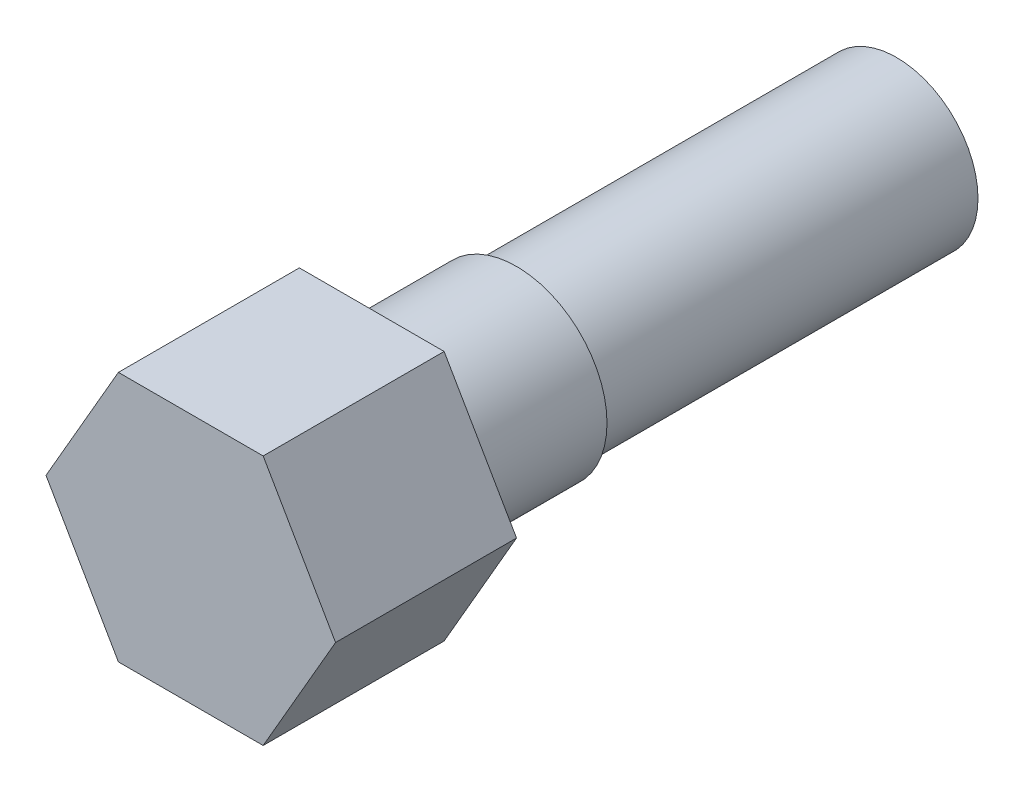
ISO-10303-21;
HEADER;
FILE_DESCRIPTION(('STEP AP214'),'2;1');
FILE_NAME('part.step','',(''),(''),'','','');
FILE_SCHEMA(('AUTOMOTIVE_DESIGN { 1 0 10303 214 1 1 1 1 }'));
ENDSEC;
DATA;
#1=APPLICATION_CONTEXT('core data for automotive mechanical design processes');
#2=APPLICATION_PROTOCOL_DEFINITION('international standard','automotive_design',2000,#1);
#3=PRODUCT_CONTEXT('',#1,'mechanical');
#4=PRODUCT('Part','Part','',(#3));
#5=PRODUCT_RELATED_PRODUCT_CATEGORY('part','',(#4));
#6=PRODUCT_DEFINITION_FORMATION('','',#4);
#7=PRODUCT_DEFINITION_CONTEXT('part definition',#1,'design');
#8=PRODUCT_DEFINITION('design','',#6,#7);
#9=PRODUCT_DEFINITION_SHAPE('','',#8);
#10=(LENGTH_UNIT() NAMED_UNIT(*) SI_UNIT(.MILLI.,.METRE.));
#11=(NAMED_UNIT(*) PLANE_ANGLE_UNIT() SI_UNIT($,.RADIAN.));
#12=(NAMED_UNIT(*) SI_UNIT($,.STERADIAN.) SOLID_ANGLE_UNIT());
#13=UNCERTAINTY_MEASURE_WITH_UNIT(LENGTH_MEASURE(1.E-05),#10,'distance_accuracy_value','');
#14=(GEOMETRIC_REPRESENTATION_CONTEXT(3) GLOBAL_UNCERTAINTY_ASSIGNED_CONTEXT((#13)) GLOBAL_UNIT_ASSIGNED_CONTEXT((#10,
#11,#12)) REPRESENTATION_CONTEXT('',''));
#15=CARTESIAN_POINT('',(0.,0.,0.));
#16=DIRECTION('',(0.,0.,1.));
#17=DIRECTION('',(1.,0.,0.));
#18=AXIS2_PLACEMENT_3D('',#15,#16,#17);
#19=CARTESIAN_POINT('',(0.,0.,-45.));
#20=DIRECTION('',(0.,0.,1.));
#21=DIRECTION('',(1.,0.,0.));
#22=AXIS2_PLACEMENT_3D('',#19,#20,#21);
#23=CYLINDRICAL_SURFACE('',#22,5.);
#24=CARTESIAN_POINT('',(0.,0.,0.));
#25=DIRECTION('',(0.,0.,1.));
#26=DIRECTION('',(1.,0.,0.));
#27=AXIS2_PLACEMENT_3D('',#24,#25,#26);
#28=CIRCLE('',#27,5.);
#29=CARTESIAN_POINT('',(5.,0.,0.));
#30=VERTEX_POINT('',#29);
#31=EDGE_CURVE('E11',#30,#30,#28,.F.);
#32=CARTESIAN_POINT('',(0.,0.,-8.));
#33=DIRECTION('',(0.,0.,-1.));
#34=DIRECTION('',(-1.,0.,0.));
#35=AXIS2_PLACEMENT_3D('',#32,#33,#34);
#36=CIRCLE('',#35,5.);
#37=CARTESIAN_POINT('',(5.,0.,-8.));
#38=VERTEX_POINT('',#37);
#39=EDGE_CURVE('E178',#38,#38,#36,.T.);
#40=CARTESIAN_POINT('',(5.,0.,0.));
#41=CARTESIAN_POINT('',(5.,0.,-0.0833333333333402));
#42=CARTESIAN_POINT('',(5.,0.,-0.166666666666674));
#43=CARTESIAN_POINT('',(5.,0.,-0.333333333333341));
#44=CARTESIAN_POINT('',(5.,0.,-0.416666666666674));
#45=CARTESIAN_POINT('',(5.,0.,-0.583333333333341));
#46=CARTESIAN_POINT('',(5.,0.,-0.666666666666674));
#47=CARTESIAN_POINT('',(5.,0.,-0.833333333333341));
#48=CARTESIAN_POINT('',(5.,0.,-0.916666666666674));
#49=CARTESIAN_POINT('',(5.,0.,-1.08333333333334));
#50=CARTESIAN_POINT('',(5.,0.,-1.16666666666667));
#51=CARTESIAN_POINT('',(5.,0.,-1.33333333333334));
#52=CARTESIAN_POINT('',(5.,0.,-1.41666666666667));
#53=CARTESIAN_POINT('',(5.,0.,-1.58333333333334));
#54=CARTESIAN_POINT('',(5.,0.,-1.66666666666667));
#55=CARTESIAN_POINT('',(5.,0.,-1.83333333333334));
#56=CARTESIAN_POINT('',(5.,0.,-1.91666666666668));
#57=CARTESIAN_POINT('',(5.,0.,-2.08333333333334));
#58=CARTESIAN_POINT('',(5.,0.,-2.16666666666667));
#59=CARTESIAN_POINT('',(5.,0.,-2.33333333333334));
#60=CARTESIAN_POINT('',(5.,0.,-2.41666666666667));
#61=CARTESIAN_POINT('',(5.,0.,-2.58333333333334));
#62=CARTESIAN_POINT('',(5.,0.,-2.66666666666667));
#63=CARTESIAN_POINT('',(5.,0.,-2.83333333333334));
#64=CARTESIAN_POINT('',(5.,0.,-2.91666666666667));
#65=CARTESIAN_POINT('',(5.,0.,-3.08333333333334));
#66=CARTESIAN_POINT('',(5.,0.,-3.16666666666667));
#67=CARTESIAN_POINT('',(5.,0.,-3.33333333333334));
#68=CARTESIAN_POINT('',(5.,0.,-3.41666666666667));
#69=CARTESIAN_POINT('',(5.,0.,-3.58333333333334));
#70=CARTESIAN_POINT('',(5.,0.,-3.66666666666667));
#71=CARTESIAN_POINT('',(5.,0.,-3.83333333333334));
#72=CARTESIAN_POINT('',(5.,0.,-3.91666666666667));
#73=CARTESIAN_POINT('',(5.,0.,-4.08333333333334));
#74=CARTESIAN_POINT('',(5.,0.,-4.16666666666667));
#75=CARTESIAN_POINT('',(5.,0.,-4.33333333333334));
#76=CARTESIAN_POINT('',(5.,0.,-4.41666666666667));
#77=CARTESIAN_POINT('',(5.,0.,-4.58333333333334));
#78=CARTESIAN_POINT('',(5.,0.,-4.66666666666667));
#79=CARTESIAN_POINT('',(5.,0.,-4.83333333333334));
#80=CARTESIAN_POINT('',(5.,0.,-4.91666666666667));
#81=CARTESIAN_POINT('',(5.,0.,-5.08333333333334));
#82=CARTESIAN_POINT('',(5.,0.,-5.16666666666667));
#83=CARTESIAN_POINT('',(5.,0.,-5.33333333333334));
#84=CARTESIAN_POINT('',(5.,0.,-5.41666666666667));
#85=CARTESIAN_POINT('',(5.,0.,-5.58333333333334));
#86=CARTESIAN_POINT('',(5.,0.,-5.66666666666667));
#87=CARTESIAN_POINT('',(5.,0.,-5.83333333333333));
#88=CARTESIAN_POINT('',(5.,0.,-5.91666666666666));
#89=CARTESIAN_POINT('',(5.,0.,-6.08333333333333));
#90=CARTESIAN_POINT('',(5.,0.,-6.16666666666667));
#91=CARTESIAN_POINT('',(5.,0.,-6.33333333333333));
#92=CARTESIAN_POINT('',(5.,0.,-6.41666666666667));
#93=CARTESIAN_POINT('',(5.,0.,-6.58333333333333));
#94=CARTESIAN_POINT('',(5.,0.,-6.66666666666667));
#95=CARTESIAN_POINT('',(5.,0.,-6.83333333333333));
#96=CARTESIAN_POINT('',(5.,0.,-6.91666666666667));
#97=CARTESIAN_POINT('',(5.,0.,-7.08333333333333));
#98=CARTESIAN_POINT('',(5.,0.,-7.16666666666667));
#99=CARTESIAN_POINT('',(5.,0.,-7.33333333333333));
#100=CARTESIAN_POINT('',(5.,0.,-7.41666666666667));
#101=CARTESIAN_POINT('',(5.,0.,-7.58333333333333));
#102=CARTESIAN_POINT('',(5.,0.,-7.66666666666667));
#103=CARTESIAN_POINT('',(5.,0.,-7.83333333333333));
#104=CARTESIAN_POINT('',(5.,0.,-7.91666666666667));
#105=CARTESIAN_POINT('',(5.,0.,-8.));
#106=B_SPLINE_CURVE_WITH_KNOTS('',3,(#40,#41,#42,#43,#44,#45,#46,#47,#48,#49,#50,#51,#52,#53,
#54,#55,#56,#57,#58,#59,#60,#61,#62,#63,#64,#65,#66,#67,#68,#69,#70,#71,#72,#73,#74,#75,#76,#77,
#78,#79,#80,#81,#82,#83,#84,#85,#86,#87,#88,#89,#90,#91,#92,#93,#94,#95,#96,#97,#98,#99,#100,
#101,#102,#103,#104,#105),.UNSPECIFIED.,.F.,.F.,(4,2,2,2,2,2,2,2,2,2,2,2,2,2,2,2,2,2,2,2,2,2,2,
2,2,2,2,2,2,2,2,2,4),(0.,0.25,0.5,0.750000000000001,1.,1.25,1.5,1.75,2.,2.25,2.5,2.75,3.,3.25,
3.5,3.75,4.,4.25,4.5,4.75,5.,5.25,5.5,5.74999999999999,5.99999999999999,6.24999999999999,
6.49999999999999,6.74999999999999,6.99999999999999,7.24999999999999,7.49999999999999,
7.74999999999999,7.99999999999999),.UNSPECIFIED.);
#107=EDGE_CURVE('BSEAM39',#30,#38,#106,.T.);
#108=ORIENTED_EDGE('',*,*,#31,.T.);
#109=ORIENTED_EDGE('',*,*,#39,.F.);
#110=ORIENTED_EDGE('',*,*,#107,.T.);
#111=ORIENTED_EDGE('',*,*,#107,.F.);
#112=EDGE_LOOP('',(#108,#110,#109,#111));
#113=FACE_BOUND('',#112,.T.);
#114=ADVANCED_FACE('F39',(#113),#23,.T.);
#115=CARTESIAN_POINT('',(0.,0.,10.));
#116=DIRECTION('',(0.,0.,1.));
#117=DIRECTION('',(1.,0.,0.));
#118=AXIS2_PLACEMENT_3D('',#115,#116,#117);
#119=PLANE('',#118);
#120=DIRECTION('',(0.5,0.866025403784439,0.));
#121=VECTOR('',#120,1.);
#122=CARTESIAN_POINT('',(4.,-6.92820323027551,10.));
#123=LINE('',#122,#121);
#124=CARTESIAN_POINT('',(4.,-6.92820323027551,10.));
#125=VERTEX_POINT('',#124);
#126=CARTESIAN_POINT('',(8.,0.,10.));
#127=VERTEX_POINT('',#126);
#128=EDGE_CURVE('E147',#125,#127,#123,.T.);
#129=ORIENTED_EDGE('',*,*,#128,.T.);
#130=DIRECTION('',(-0.5,0.866025403784438,0.));
#131=VECTOR('',#130,1.);
#132=CARTESIAN_POINT('',(8.,0.,10.));
#133=LINE('',#132,#131);
#134=CARTESIAN_POINT('',(4.,6.92820323027551,10.));
#135=VERTEX_POINT('',#134);
#136=EDGE_CURVE('E95',#127,#135,#133,.T.);
#137=ORIENTED_EDGE('',*,*,#136,.T.);
#138=DIRECTION('',(-1.,0.,0.));
#139=VECTOR('',#138,1.);
#140=CARTESIAN_POINT('',(4.,6.92820323027551,10.));
#141=LINE('',#140,#139);
#142=CARTESIAN_POINT('',(-4.,6.92820323027551,10.));
#143=VERTEX_POINT('',#142);
#144=EDGE_CURVE('E108',#135,#143,#141,.T.);
#145=ORIENTED_EDGE('',*,*,#144,.T.);
#146=DIRECTION('',(-0.5,-0.866025403784439,0.));
#147=VECTOR('',#146,1.);
#148=CARTESIAN_POINT('',(-4.,6.92820323027551,10.));
#149=LINE('',#148,#147);
#150=CARTESIAN_POINT('',(-8.,0.,10.));
#151=VERTEX_POINT('',#150);
#152=EDGE_CURVE('E102',#143,#151,#149,.T.);
#153=ORIENTED_EDGE('',*,*,#152,.T.);
#154=DIRECTION('',(0.5,-0.866025403784439,0.));
#155=VECTOR('',#154,1.);
#156=CARTESIAN_POINT('',(-8.,0.,10.));
#157=LINE('',#156,#155);
#158=CARTESIAN_POINT('',(-4.,-6.92820323027551,10.));
#159=VERTEX_POINT('',#158);
#160=EDGE_CURVE('E106',#151,#159,#157,.T.);
#161=ORIENTED_EDGE('',*,*,#160,.T.);
#162=DIRECTION('',(1.,0.,0.));
#163=VECTOR('',#162,1.);
#164=CARTESIAN_POINT('',(-4.,-6.92820323027551,10.));
#165=LINE('',#164,#163);
#166=EDGE_CURVE('E57',#159,#125,#165,.T.);
#167=ORIENTED_EDGE('',*,*,#166,.T.);
#168=EDGE_LOOP('',(#129,#137,#145,#153,#161,#167));
#169=FACE_BOUND('',#168,.T.);
#170=ADVANCED_FACE('F104',(#169),#119,.T.);
#171=CARTESIAN_POINT('',(8.,0.,10.));
#172=DIRECTION('',(-0.866025403784438,-0.5,0.));
#173=DIRECTION('',(0.5,-0.866025403784439,0.));
#174=AXIS2_PLACEMENT_3D('',#171,#172,#173);
#175=PLANE('',#174);
#176=DIRECTION('',(-0.5,0.866025403784438,0.));
#177=VECTOR('',#176,1.);
#178=CARTESIAN_POINT('',(8.,0.,0.));
#179=LINE('',#178,#177);
#180=CARTESIAN_POINT('',(8.,0.,0.));
#181=VERTEX_POINT('',#180);
#182=CARTESIAN_POINT('',(4.,6.92820323027551,0.));
#183=VERTEX_POINT('',#182);
#184=EDGE_CURVE('E134',#181,#183,#179,.T.);
#185=ORIENTED_EDGE('',*,*,#184,.T.);
#186=DIRECTION('',(0.,0.,-1.));
#187=VECTOR('',#186,1.);
#188=CARTESIAN_POINT('',(4.,6.92820323027551,10.));
#189=LINE('',#188,#187);
#190=EDGE_CURVE('E154',#135,#183,#189,.T.);
#191=ORIENTED_EDGE('',*,*,#190,.F.);
#192=ORIENTED_EDGE('',*,*,#136,.F.);
#193=DIRECTION('',(0.,0.,-1.));
#194=VECTOR('',#193,1.);
#195=CARTESIAN_POINT('',(8.,0.,10.));
#196=LINE('',#195,#194);
#197=EDGE_CURVE('E49',#127,#181,#196,.T.);
#198=ORIENTED_EDGE('',*,*,#197,.T.);
#199=EDGE_LOOP('',(#185,#191,#192,#198));
#200=FACE_BOUND('',#199,.T.);
#201=ADVANCED_FACE('F159',(#200),#175,.F.);
#202=CARTESIAN_POINT('',(4.,6.92820323027551,10.));
#203=DIRECTION('',(0.,-1.,0.));
#204=DIRECTION('',(0.,0.,-1.));
#205=AXIS2_PLACEMENT_3D('',#202,#203,#204);
#206=PLANE('',#205);
#207=DIRECTION('',(-1.,0.,0.));
#208=VECTOR('',#207,1.);
#209=CARTESIAN_POINT('',(4.,6.92820323027551,0.));
#210=LINE('',#209,#208);
#211=CARTESIAN_POINT('',(-4.,6.92820323027551,0.));
#212=VERTEX_POINT('',#211);
#213=EDGE_CURVE('E138',#183,#212,#210,.T.);
#214=ORIENTED_EDGE('',*,*,#213,.T.);
#215=DIRECTION('',(0.,0.,-1.));
#216=VECTOR('',#215,1.);
#217=CARTESIAN_POINT('',(-4.,6.92820323027551,10.));
#218=LINE('',#217,#216);
#219=EDGE_CURVE('E119',#143,#212,#218,.T.);
#220=ORIENTED_EDGE('',*,*,#219,.F.);
#221=ORIENTED_EDGE('',*,*,#144,.F.);
#222=ORIENTED_EDGE('',*,*,#190,.T.);
#223=EDGE_LOOP('',(#214,#220,#221,#222));
#224=FACE_BOUND('',#223,.T.);
#225=ADVANCED_FACE('F168',(#224),#206,.F.);
#226=CARTESIAN_POINT('',(-4.,6.92820323027551,10.));
#227=DIRECTION('',(0.866025403784439,-0.5,0.));
#228=DIRECTION('',(0.5,0.866025403784439,0.));
#229=AXIS2_PLACEMENT_3D('',#226,#227,#228);
#230=PLANE('',#229);
#231=DIRECTION('',(-0.5,-0.866025403784439,0.));
#232=VECTOR('',#231,1.);
#233=CARTESIAN_POINT('',(-4.,6.92820323027551,0.));
#234=LINE('',#233,#232);
#235=CARTESIAN_POINT('',(-8.,0.,0.));
#236=VERTEX_POINT('',#235);
#237=EDGE_CURVE('E117',#212,#236,#234,.T.);
#238=ORIENTED_EDGE('',*,*,#237,.T.);
#239=DIRECTION('',(0.,0.,-1.));
#240=VECTOR('',#239,1.);
#241=CARTESIAN_POINT('',(-8.,0.,10.));
#242=LINE('',#241,#240);
#243=EDGE_CURVE('E114',#151,#236,#242,.T.);
#244=ORIENTED_EDGE('',*,*,#243,.F.);
#245=ORIENTED_EDGE('',*,*,#152,.F.);
#246=ORIENTED_EDGE('',*,*,#219,.T.);
#247=EDGE_LOOP('',(#238,#244,#245,#246));
#248=FACE_BOUND('',#247,.T.);
#249=ADVANCED_FACE('F115',(#248),#230,.F.);
#250=CARTESIAN_POINT('',(-8.,0.,10.));
#251=DIRECTION('',(0.866025403784439,0.5,0.));
#252=DIRECTION('',(-0.5,0.866025403784439,0.));
#253=AXIS2_PLACEMENT_3D('',#250,#251,#252);
#254=PLANE('',#253);
#255=DIRECTION('',(0.5,-0.866025403784439,0.));
#256=VECTOR('',#255,1.);
#257=CARTESIAN_POINT('',(-8.,0.,0.));
#258=LINE('',#257,#256);
#259=CARTESIAN_POINT('',(-4.,-6.92820323027551,0.));
#260=VERTEX_POINT('',#259);
#261=EDGE_CURVE('E80',#236,#260,#258,.T.);
#262=ORIENTED_EDGE('',*,*,#261,.T.);
#263=DIRECTION('',(0.,0.,-1.));
#264=VECTOR('',#263,1.);
#265=CARTESIAN_POINT('',(-4.,-6.92820323027551,10.));
#266=LINE('',#265,#264);
#267=EDGE_CURVE('E120',#159,#260,#266,.T.);
#268=ORIENTED_EDGE('',*,*,#267,.F.);
#269=ORIENTED_EDGE('',*,*,#160,.F.);
#270=ORIENTED_EDGE('',*,*,#243,.T.);
#271=EDGE_LOOP('',(#262,#268,#269,#270));
#272=FACE_BOUND('',#271,.T.);
#273=ADVANCED_FACE('F122',(#272),#254,.F.);
#274=CARTESIAN_POINT('',(-4.,-6.92820323027551,10.));
#275=DIRECTION('',(0.,1.,0.));
#276=DIRECTION('',(0.,0.,1.));
#277=AXIS2_PLACEMENT_3D('',#274,#275,#276);
#278=PLANE('',#277);
#279=DIRECTION('',(1.,0.,0.));
#280=VECTOR('',#279,1.);
#281=CARTESIAN_POINT('',(-4.,-6.92820323027551,0.));
#282=LINE('',#281,#280);
#283=CARTESIAN_POINT('',(4.,-6.92820323027551,0.));
#284=VERTEX_POINT('',#283);
#285=EDGE_CURVE('E86',#260,#284,#282,.T.);
#286=ORIENTED_EDGE('',*,*,#285,.T.);
#287=DIRECTION('',(0.,0.,-1.));
#288=VECTOR('',#287,1.);
#289=CARTESIAN_POINT('',(4.,-6.92820323027551,10.));
#290=LINE('',#289,#288);
#291=EDGE_CURVE('E126',#125,#284,#290,.T.);
#292=ORIENTED_EDGE('',*,*,#291,.F.);
#293=ORIENTED_EDGE('',*,*,#166,.F.);
#294=ORIENTED_EDGE('',*,*,#267,.T.);
#295=EDGE_LOOP('',(#286,#292,#293,#294));
#296=FACE_BOUND('',#295,.T.);
#297=ADVANCED_FACE('F208',(#296),#278,.F.);
#298=CARTESIAN_POINT('',(4.,-6.92820323027551,10.));
#299=DIRECTION('',(-0.866025403784439,0.5,0.));
#300=DIRECTION('',(-0.5,-0.866025403784439,0.));
#301=AXIS2_PLACEMENT_3D('',#298,#299,#300);
#302=PLANE('',#301);
#303=DIRECTION('',(0.5,0.866025403784439,0.));
#304=VECTOR('',#303,1.);
#305=CARTESIAN_POINT('',(4.,-6.92820323027551,0.));
#306=LINE('',#305,#304);
#307=EDGE_CURVE('E130',#284,#181,#306,.T.);
#308=ORIENTED_EDGE('',*,*,#307,.T.);
#309=ORIENTED_EDGE('',*,*,#197,.F.);
#310=ORIENTED_EDGE('',*,*,#128,.F.);
#311=ORIENTED_EDGE('',*,*,#291,.T.);
#312=EDGE_LOOP('',(#308,#309,#310,#311));
#313=FACE_BOUND('',#312,.T.);
#314=ADVANCED_FACE('F41',(#313),#302,.F.);
#315=CARTESIAN_POINT('',(0.,0.,0.));
#316=DIRECTION('',(0.,0.,1.));
#317=DIRECTION('',(1.,0.,0.));
#318=AXIS2_PLACEMENT_3D('',#315,#316,#317);
#319=PLANE('',#318);
#320=ORIENTED_EDGE('',*,*,#307,.F.);
#321=ORIENTED_EDGE('',*,*,#285,.F.);
#322=ORIENTED_EDGE('',*,*,#261,.F.);
#323=ORIENTED_EDGE('',*,*,#237,.F.);
#324=ORIENTED_EDGE('',*,*,#213,.F.);
#325=ORIENTED_EDGE('',*,*,#184,.F.);
#326=EDGE_LOOP('',(#320,#321,#322,#323,#324,#325));
#327=FACE_BOUND('',#326,.T.);
#328=ORIENTED_EDGE('',*,*,#31,.F.);
#329=EDGE_LOOP('',(#328));
#330=FACE_BOUND('',#329,.T.);
#331=ADVANCED_FACE('F164',(#327,#330),#319,.F.);
#332=CARTESIAN_POINT('',(0.,0.,-8.));
#333=DIRECTION('',(0.,0.,-1.));
#334=DIRECTION('',(-1.,0.,0.));
#335=AXIS2_PLACEMENT_3D('',#332,#333,#334);
#336=PLANE('',#335);
#337=CARTESIAN_POINT('',(0.,0.,-8.));
#338=DIRECTION('',(0.,0.,-1.));
#339=DIRECTION('',(-1.,0.,0.));
#340=AXIS2_PLACEMENT_3D('',#337,#338,#339);
#341=CIRCLE('',#340,4.5);
#342=CARTESIAN_POINT('',(4.5,0.,-7.99999999999999));
#343=VERTEX_POINT('',#342);
#344=EDGE_CURVE('E182',#343,#343,#341,.T.);
#345=ORIENTED_EDGE('',*,*,#344,.F.);
#346=EDGE_LOOP('',(#345));
#347=FACE_BOUND('',#346,.T.);
#348=ORIENTED_EDGE('',*,*,#39,.T.);
#349=EDGE_LOOP('',(#348));
#350=FACE_BOUND('',#349,.T.);
#351=ADVANCED_FACE('F189',(#347,#350),#336,.T.);
#352=CARTESIAN_POINT('',(0.,0.,-29.));
#353=DIRECTION('',(0.,0.,-1.));
#354=DIRECTION('',(-1.,0.,0.));
#355=AXIS2_PLACEMENT_3D('',#352,#353,#354);
#356=PLANE('',#355);
#357=CARTESIAN_POINT('',(0.,0.,-29.));
#358=DIRECTION('',(0.,0.,-1.));
#359=DIRECTION('',(-1.,0.,0.));
#360=AXIS2_PLACEMENT_3D('',#357,#358,#359);
#361=CIRCLE('',#360,4.5);
#362=CARTESIAN_POINT('',(4.5,0.,-29.));
#363=VERTEX_POINT('',#362);
#364=EDGE_CURVE('E135',#363,#363,#361,.T.);
#365=ORIENTED_EDGE('',*,*,#364,.T.);
#366=EDGE_LOOP('',(#365));
#367=FACE_BOUND('',#366,.T.);
#368=ADVANCED_FACE('F192',(#367),#356,.T.);
#369=CARTESIAN_POINT('',(0.,0.,-29.));
#370=DIRECTION('',(0.,0.,1.));
#371=DIRECTION('',(1.,0.,0.));
#372=AXIS2_PLACEMENT_3D('',#369,#370,#371);
#373=CYLINDRICAL_SURFACE('',#372,4.5);
#374=CARTESIAN_POINT('',(4.5,0.,-29.));
#375=CARTESIAN_POINT('',(4.5,0.,-28.78125));
#376=CARTESIAN_POINT('',(4.5,0.,-28.5625));
#377=CARTESIAN_POINT('',(4.5,0.,-28.125));
#378=CARTESIAN_POINT('',(4.5,0.,-27.90625));
#379=CARTESIAN_POINT('',(4.5,0.,-27.46875));
#380=CARTESIAN_POINT('',(4.5,0.,-27.25));
#381=CARTESIAN_POINT('',(4.5,0.,-26.8125));
#382=CARTESIAN_POINT('',(4.5,0.,-26.59375));
#383=CARTESIAN_POINT('',(4.5,0.,-26.15625));
#384=CARTESIAN_POINT('',(4.5,0.,-25.9375));
#385=CARTESIAN_POINT('',(4.5,0.,-25.5));
#386=CARTESIAN_POINT('',(4.5,0.,-25.28125));
#387=CARTESIAN_POINT('',(4.5,0.,-24.84375));
#388=CARTESIAN_POINT('',(4.5,0.,-24.625));
#389=CARTESIAN_POINT('',(4.5,0.,-24.1875));
#390=CARTESIAN_POINT('',(4.5,0.,-23.96875));
#391=CARTESIAN_POINT('',(4.5,0.,-23.53125));
#392=CARTESIAN_POINT('',(4.5,0.,-23.3125));
#393=CARTESIAN_POINT('',(4.5,0.,-22.875));
#394=CARTESIAN_POINT('',(4.5,0.,-22.65625));
#395=CARTESIAN_POINT('',(4.5,0.,-22.21875));
#396=CARTESIAN_POINT('',(4.5,0.,-22.));
#397=CARTESIAN_POINT('',(4.5,0.,-21.5625));
#398=CARTESIAN_POINT('',(4.5,0.,-21.34375));
#399=CARTESIAN_POINT('',(4.5,0.,-20.90625));
#400=CARTESIAN_POINT('',(4.5,0.,-20.6875));
#401=CARTESIAN_POINT('',(4.5,0.,-20.25));
#402=CARTESIAN_POINT('',(4.5,0.,-20.03125));
#403=CARTESIAN_POINT('',(4.5,0.,-19.59375));
#404=CARTESIAN_POINT('',(4.5,0.,-19.375));
#405=CARTESIAN_POINT('',(4.5,0.,-18.9375));
#406=CARTESIAN_POINT('',(4.5,0.,-18.71875));
#407=CARTESIAN_POINT('',(4.5,0.,-18.28125));
#408=CARTESIAN_POINT('',(4.5,0.,-18.0625));
#409=CARTESIAN_POINT('',(4.5,0.,-17.625));
#410=CARTESIAN_POINT('',(4.5,0.,-17.40625));
#411=CARTESIAN_POINT('',(4.5,0.,-16.96875));
#412=CARTESIAN_POINT('',(4.5,0.,-16.75));
#413=CARTESIAN_POINT('',(4.5,0.,-16.3125));
#414=CARTESIAN_POINT('',(4.5,0.,-16.09375));
#415=CARTESIAN_POINT('',(4.5,0.,-15.65625));
#416=CARTESIAN_POINT('',(4.5,0.,-15.4375));
#417=CARTESIAN_POINT('',(4.5,0.,-15.));
#418=CARTESIAN_POINT('',(4.5,0.,-14.78125));
#419=CARTESIAN_POINT('',(4.5,0.,-14.34375));
#420=CARTESIAN_POINT('',(4.5,0.,-14.125));
#421=CARTESIAN_POINT('',(4.5,0.,-13.6875));
#422=CARTESIAN_POINT('',(4.5,0.,-13.46875));
#423=CARTESIAN_POINT('',(4.5,0.,-13.03125));
#424=CARTESIAN_POINT('',(4.5,0.,-12.8125));
#425=CARTESIAN_POINT('',(4.5,0.,-12.375));
#426=CARTESIAN_POINT('',(4.5,0.,-12.15625));
#427=CARTESIAN_POINT('',(4.5,0.,-11.71875));
#428=CARTESIAN_POINT('',(4.5,0.,-11.5));
#429=CARTESIAN_POINT('',(4.5,0.,-11.0625));
#430=CARTESIAN_POINT('',(4.5,0.,-10.84375));
#431=CARTESIAN_POINT('',(4.5,0.,-10.40625));
#432=CARTESIAN_POINT('',(4.5,0.,-10.1875));
#433=CARTESIAN_POINT('',(4.5,0.,-9.74999999999999));
#434=CARTESIAN_POINT('',(4.5,0.,-9.53124999999999));
#435=CARTESIAN_POINT('',(4.5,0.,-9.09374999999999));
#436=CARTESIAN_POINT('',(4.5,0.,-8.87499999999999));
#437=CARTESIAN_POINT('',(4.5,0.,-8.43749999999999));
#438=CARTESIAN_POINT('',(4.5,0.,-8.21874999999999));
#439=CARTESIAN_POINT('',(4.5,0.,-7.99999999999999));
#440=B_SPLINE_CURVE_WITH_KNOTS('',3,(#374,#375,#376,#377,#378,#379,#380,#381,#382,#383,#384,
#385,#386,#387,#388,#389,#390,#391,#392,#393,#394,#395,#396,#397,#398,#399,#400,#401,#402,#403,
#404,#405,#406,#407,#408,#409,#410,#411,#412,#413,#414,#415,#416,#417,#418,#419,#420,#421,#422,
#423,#424,#425,#426,#427,#428,#429,#430,#431,#432,#433,#434,#435,#436,#437,#438,#439),
.UNSPECIFIED.,.F.,.F.,(4,2,2,2,2,2,2,2,2,2,2,2,2,2,2,2,2,2,2,2,2,2,2,2,2,2,2,2,2,2,2,2,4),(0.,
0.656250000000001,1.3125,1.96875,2.625,3.28125,3.9375,4.59375,5.25,5.90625000000001,
6.56250000000001,7.21875000000001,7.875,8.53125,9.18750000000001,9.84375000000001,10.5,11.15625,
11.8125,12.46875,13.125,13.78125,14.4375,15.09375,15.75,16.40625,17.0625,17.71875,18.375,
19.03125,19.6875,20.34375,21.),.UNSPECIFIED.);
#441=EDGE_CURVE('BSEAM187',#363,#343,#440,.T.);
#442=ORIENTED_EDGE('',*,*,#364,.F.);
#443=ORIENTED_EDGE('',*,*,#344,.T.);
#444=ORIENTED_EDGE('',*,*,#441,.T.);
#445=ORIENTED_EDGE('',*,*,#441,.F.);
#446=EDGE_LOOP('',(#442,#444,#443,#445));
#447=FACE_BOUND('',#446,.T.);
#448=ADVANCED_FACE('F187',(#447),#373,.T.);
#449=CLOSED_SHELL('',(#114,#170,#201,#225,#249,#273,#297,#314,#331,#351,#368,#448));
#450=MANIFOLD_SOLID_BREP('B2',#449);
#451=ADVANCED_BREP_SHAPE_REPRESENTATION('',(#18,#450),#14);
#452=SHAPE_DEFINITION_REPRESENTATION(#9,#451);
ENDSEC;
END-ISO-10303-21;
